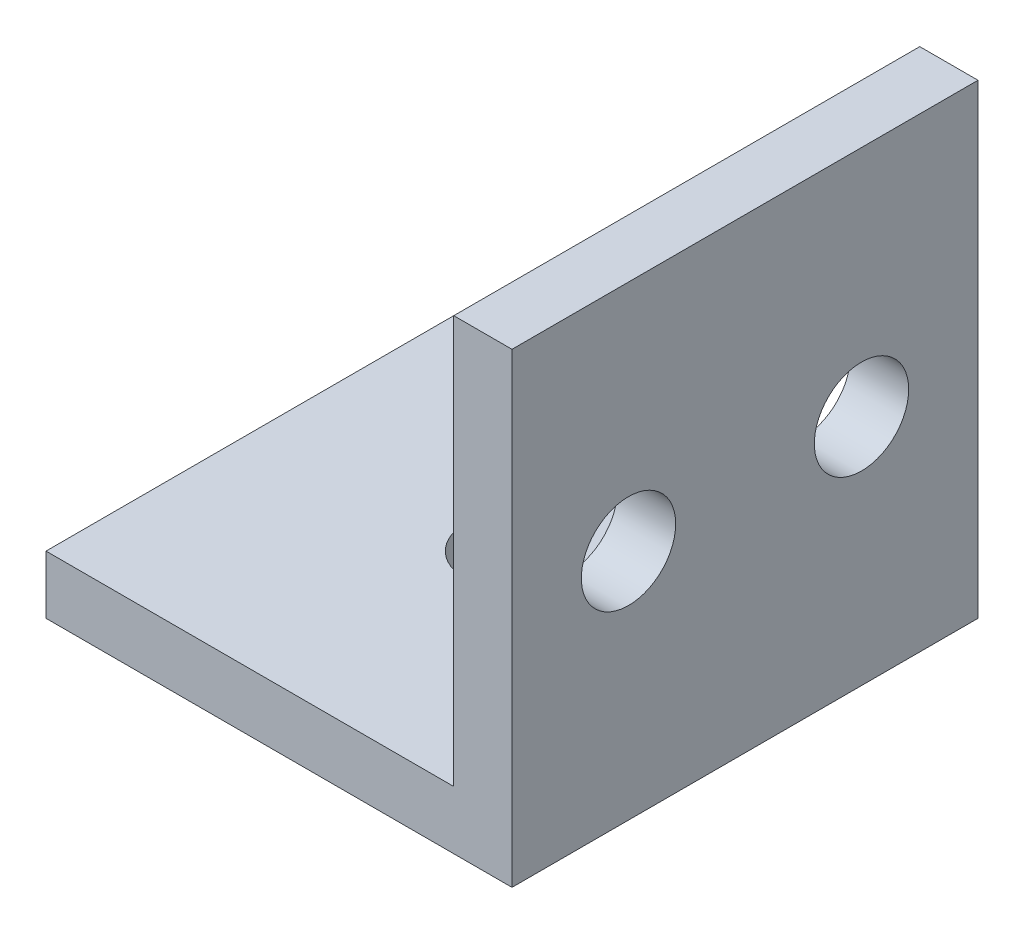
ISO-10303-21;
HEADER;
FILE_DESCRIPTION(('STEP AP214'),'2;1');
FILE_NAME('part.step','',(''),(''),'','','');
FILE_SCHEMA(('AUTOMOTIVE_DESIGN { 1 0 10303 214 1 1 1 1 }'));
ENDSEC;
DATA;
#1=APPLICATION_CONTEXT('core data for automotive mechanical design processes');
#2=APPLICATION_PROTOCOL_DEFINITION('international standard','automotive_design',2000,#1);
#3=PRODUCT_CONTEXT('',#1,'mechanical');
#4=PRODUCT('Part','Part','',(#3));
#5=PRODUCT_RELATED_PRODUCT_CATEGORY('part','',(#4));
#6=PRODUCT_DEFINITION_FORMATION('','',#4);
#7=PRODUCT_DEFINITION_CONTEXT('part definition',#1,'design');
#8=PRODUCT_DEFINITION('design','',#6,#7);
#9=PRODUCT_DEFINITION_SHAPE('','',#8);
#10=(LENGTH_UNIT() NAMED_UNIT(*) SI_UNIT(.MILLI.,.METRE.));
#11=(NAMED_UNIT(*) PLANE_ANGLE_UNIT() SI_UNIT($,.RADIAN.));
#12=(NAMED_UNIT(*) SI_UNIT($,.STERADIAN.) SOLID_ANGLE_UNIT());
#13=UNCERTAINTY_MEASURE_WITH_UNIT(LENGTH_MEASURE(1.E-05),#10,'distance_accuracy_value','');
#14=(GEOMETRIC_REPRESENTATION_CONTEXT(3) GLOBAL_UNCERTAINTY_ASSIGNED_CONTEXT((#13)) GLOBAL_UNIT_ASSIGNED_CONTEXT((#10,
#11,#12)) REPRESENTATION_CONTEXT('',''));
#15=CARTESIAN_POINT('',(0.,0.,0.));
#16=DIRECTION('',(0.,0.,1.));
#17=DIRECTION('',(1.,0.,0.));
#18=AXIS2_PLACEMENT_3D('',#15,#16,#17);
#19=CARTESIAN_POINT('',(0.,5.,0.));
#20=DIRECTION('',(0.,1.,0.));
#21=DIRECTION('',(0.,0.,1.));
#22=AXIS2_PLACEMENT_3D('',#19,#20,#21);
#23=PLANE('',#22);
#24=DIRECTION('',(0.,0.,1.));
#25=VECTOR('',#24,1.);
#26=CARTESIAN_POINT('',(15.,5.,-20.));
#27=LINE('',#26,#25);
#28=CARTESIAN_POINT('',(15.,5.,-20.));
#29=VERTEX_POINT('',#28);
#30=CARTESIAN_POINT('',(15.,5.,20.));
#31=VERTEX_POINT('',#30);
#32=EDGE_CURVE('E52',#29,#31,#27,.T.);
#33=ORIENTED_EDGE('',*,*,#32,.F.);
#34=DIRECTION('',(-1.,0.,0.));
#35=VECTOR('',#34,1.);
#36=CARTESIAN_POINT('',(-20.,5.,-20.));
#37=LINE('',#36,#35);
#38=CARTESIAN_POINT('',(-20.,5.,-20.));
#39=VERTEX_POINT('',#38);
#40=EDGE_CURVE('E57',#29,#39,#37,.T.);
#41=ORIENTED_EDGE('',*,*,#40,.T.);
#42=DIRECTION('',(0.,0.,1.));
#43=VECTOR('',#42,1.);
#44=CARTESIAN_POINT('',(-20.,5.,-20.));
#45=LINE('',#44,#43);
#46=CARTESIAN_POINT('',(-20.,5.,20.));
#47=VERTEX_POINT('',#46);
#48=EDGE_CURVE('E88',#39,#47,#45,.T.);
#49=ORIENTED_EDGE('',*,*,#48,.T.);
#50=DIRECTION('',(1.,0.,0.));
#51=VECTOR('',#50,1.);
#52=CARTESIAN_POINT('',(-20.,5.,20.));
#53=LINE('',#52,#51);
#54=EDGE_CURVE('E146',#47,#31,#53,.T.);
#55=ORIENTED_EDGE('',*,*,#54,.T.);
#56=EDGE_LOOP('',(#33,#41,#49,#55));
#57=FACE_BOUND('',#56,.T.);
#58=CARTESIAN_POINT('',(0.,5.,0.));
#59=DIRECTION('',(0.,1.,0.));
#60=DIRECTION('',(0.,0.,1.));
#61=AXIS2_PLACEMENT_3D('',#58,#59,#60);
#62=CIRCLE('',#61,4.05);
#63=CARTESIAN_POINT('',(0.,5.,4.05));
#64=VERTEX_POINT('',#63);
#65=EDGE_CURVE('E99',#64,#64,#62,.T.);
#66=ORIENTED_EDGE('',*,*,#65,.F.);
#67=EDGE_LOOP('',(#66));
#68=FACE_BOUND('',#67,.T.);
#69=ADVANCED_FACE('F35',(#57,#68),#23,.T.);
#70=CARTESIAN_POINT('',(0.,0.,0.));
#71=DIRECTION('',(0.,1.,0.));
#72=DIRECTION('',(0.,0.,1.));
#73=AXIS2_PLACEMENT_3D('',#70,#71,#72);
#74=PLANE('',#73);
#75=DIRECTION('',(0.,0.,1.));
#76=VECTOR('',#75,1.);
#77=CARTESIAN_POINT('',(-20.,0.,-20.));
#78=LINE('',#77,#76);
#79=CARTESIAN_POINT('',(-20.,0.,-20.));
#80=VERTEX_POINT('',#79);
#81=CARTESIAN_POINT('',(-20.,0.,20.));
#82=VERTEX_POINT('',#81);
#83=EDGE_CURVE('E94',#80,#82,#78,.T.);
#84=ORIENTED_EDGE('',*,*,#83,.F.);
#85=DIRECTION('',(-1.,0.,0.));
#86=VECTOR('',#85,1.);
#87=CARTESIAN_POINT('',(-20.,0.,-20.));
#88=LINE('',#87,#86);
#89=CARTESIAN_POINT('',(20.,0.,-20.));
#90=VERTEX_POINT('',#89);
#91=EDGE_CURVE('E77',#90,#80,#88,.T.);
#92=ORIENTED_EDGE('',*,*,#91,.F.);
#93=DIRECTION('',(0.,0.,-1.));
#94=VECTOR('',#93,1.);
#95=CARTESIAN_POINT('',(20.,0.,-20.));
#96=LINE('',#95,#94);
#97=CARTESIAN_POINT('',(20.,0.,20.));
#98=VERTEX_POINT('',#97);
#99=EDGE_CURVE('E89',#98,#90,#96,.T.);
#100=ORIENTED_EDGE('',*,*,#99,.F.);
#101=DIRECTION('',(1.,0.,0.));
#102=VECTOR('',#101,1.);
#103=CARTESIAN_POINT('',(-20.,0.,20.));
#104=LINE('',#103,#102);
#105=EDGE_CURVE('E98',#82,#98,#104,.T.);
#106=ORIENTED_EDGE('',*,*,#105,.F.);
#107=EDGE_LOOP('',(#84,#92,#100,#106));
#108=FACE_BOUND('',#107,.T.);
#109=CARTESIAN_POINT('',(0.,0.,0.));
#110=DIRECTION('',(0.,1.,0.));
#111=DIRECTION('',(0.,0.,1.));
#112=AXIS2_PLACEMENT_3D('',#109,#110,#111);
#113=CIRCLE('',#112,4.05);
#114=CARTESIAN_POINT('',(0.,0.,4.05));
#115=VERTEX_POINT('',#114);
#116=EDGE_CURVE('E103',#115,#115,#113,.T.);
#117=ORIENTED_EDGE('',*,*,#116,.T.);
#118=EDGE_LOOP('',(#117));
#119=FACE_BOUND('',#118,.T.);
#120=ADVANCED_FACE('F96',(#108,#119),#74,.F.);
#121=CARTESIAN_POINT('',(-20.,5.,-20.));
#122=DIRECTION('',(1.,0.,0.));
#123=DIRECTION('',(0.,0.,-1.));
#124=AXIS2_PLACEMENT_3D('',#121,#122,#123);
#125=PLANE('',#124);
#126=ORIENTED_EDGE('',*,*,#83,.T.);
#127=DIRECTION('',(0.,-1.,0.));
#128=VECTOR('',#127,1.);
#129=CARTESIAN_POINT('',(-20.,5.,20.));
#130=LINE('',#129,#128);
#131=EDGE_CURVE('E11',#47,#82,#130,.T.);
#132=ORIENTED_EDGE('',*,*,#131,.F.);
#133=ORIENTED_EDGE('',*,*,#48,.F.);
#134=DIRECTION('',(0.,-1.,0.));
#135=VECTOR('',#134,1.);
#136=CARTESIAN_POINT('',(-20.,5.,-20.));
#137=LINE('',#136,#135);
#138=EDGE_CURVE('E80',#39,#80,#137,.T.);
#139=ORIENTED_EDGE('',*,*,#138,.T.);
#140=EDGE_LOOP('',(#126,#132,#133,#139));
#141=FACE_BOUND('',#140,.T.);
#142=ADVANCED_FACE('F37',(#141),#125,.F.);
#143=CARTESIAN_POINT('',(-20.,5.,20.));
#144=DIRECTION('',(0.,0.,-1.));
#145=DIRECTION('',(-1.,0.,0.));
#146=AXIS2_PLACEMENT_3D('',#143,#144,#145);
#147=PLANE('',#146);
#148=ORIENTED_EDGE('',*,*,#105,.T.);
#149=DIRECTION('',(0.,-1.,0.));
#150=VECTOR('',#149,1.);
#151=CARTESIAN_POINT('',(20.,5.,20.));
#152=LINE('',#151,#150);
#153=CARTESIAN_POINT('',(20.,40.,20.));
#154=VERTEX_POINT('',#153);
#155=EDGE_CURVE('E44',#154,#98,#152,.T.);
#156=ORIENTED_EDGE('',*,*,#155,.F.);
#157=DIRECTION('',(1.,0.,0.));
#158=VECTOR('',#157,1.);
#159=CARTESIAN_POINT('',(15.,40.,20.));
#160=LINE('',#159,#158);
#161=CARTESIAN_POINT('',(15.,40.,20.));
#162=VERTEX_POINT('',#161);
#163=EDGE_CURVE('E128',#162,#154,#160,.T.);
#164=ORIENTED_EDGE('',*,*,#163,.F.);
#165=DIRECTION('',(0.,-1.,0.));
#166=VECTOR('',#165,1.);
#167=CARTESIAN_POINT('',(15.,40.,20.));
#168=LINE('',#167,#166);
#169=EDGE_CURVE('E141',#162,#31,#168,.T.);
#170=ORIENTED_EDGE('',*,*,#169,.T.);
#171=ORIENTED_EDGE('',*,*,#54,.F.);
#172=ORIENTED_EDGE('',*,*,#131,.T.);
#173=EDGE_LOOP('',(#148,#156,#164,#170,#171,#172));
#174=FACE_BOUND('',#173,.T.);
#175=ADVANCED_FACE('F153',(#174),#147,.F.);
#176=CARTESIAN_POINT('',(20.,5.,-20.));
#177=DIRECTION('',(-1.,0.,0.));
#178=DIRECTION('',(0.,0.,1.));
#179=AXIS2_PLACEMENT_3D('',#176,#177,#178);
#180=PLANE('',#179);
#181=CARTESIAN_POINT('',(20.,20.,10.));
#182=DIRECTION('',(1.,0.,0.));
#183=DIRECTION('',(0.,0.,-1.));
#184=AXIS2_PLACEMENT_3D('',#181,#182,#183);
#185=CIRCLE('',#184,4.05);
#186=CARTESIAN_POINT('',(20.,20.,5.95));
#187=VERTEX_POINT('',#186);
#188=EDGE_CURVE('E113',#187,#187,#185,.T.);
#189=ORIENTED_EDGE('',*,*,#188,.F.);
#190=EDGE_LOOP('',(#189));
#191=FACE_BOUND('',#190,.T.);
#192=CARTESIAN_POINT('',(20.,20.,-10.));
#193=DIRECTION('',(1.,0.,0.));
#194=DIRECTION('',(0.,0.,-1.));
#195=AXIS2_PLACEMENT_3D('',#192,#193,#194);
#196=CIRCLE('',#195,4.05);
#197=CARTESIAN_POINT('',(20.,20.,-14.05));
#198=VERTEX_POINT('',#197);
#199=EDGE_CURVE('E118',#198,#198,#196,.T.);
#200=ORIENTED_EDGE('',*,*,#199,.F.);
#201=EDGE_LOOP('',(#200));
#202=FACE_BOUND('',#201,.T.);
#203=ORIENTED_EDGE('',*,*,#99,.T.);
#204=DIRECTION('',(0.,-1.,0.));
#205=VECTOR('',#204,1.);
#206=CARTESIAN_POINT('',(20.,5.,-20.));
#207=LINE('',#206,#205);
#208=CARTESIAN_POINT('',(20.,40.,-20.));
#209=VERTEX_POINT('',#208);
#210=EDGE_CURVE('E84',#209,#90,#207,.T.);
#211=ORIENTED_EDGE('',*,*,#210,.F.);
#212=DIRECTION('',(0.,0.,-1.));
#213=VECTOR('',#212,1.);
#214=CARTESIAN_POINT('',(20.,40.,-20.));
#215=LINE('',#214,#213);
#216=EDGE_CURVE('E131',#154,#209,#215,.T.);
#217=ORIENTED_EDGE('',*,*,#216,.F.);
#218=ORIENTED_EDGE('',*,*,#155,.T.);
#219=EDGE_LOOP('',(#203,#211,#217,#218));
#220=FACE_BOUND('',#219,.T.);
#221=ADVANCED_FACE('F169',(#191,#202,#220),#180,.F.);
#222=CARTESIAN_POINT('',(-20.,5.,-20.));
#223=DIRECTION('',(0.,0.,1.));
#224=DIRECTION('',(1.,0.,0.));
#225=AXIS2_PLACEMENT_3D('',#222,#223,#224);
#226=PLANE('',#225);
#227=ORIENTED_EDGE('',*,*,#91,.T.);
#228=ORIENTED_EDGE('',*,*,#138,.F.);
#229=ORIENTED_EDGE('',*,*,#40,.F.);
#230=DIRECTION('',(0.,-1.,0.));
#231=VECTOR('',#230,1.);
#232=CARTESIAN_POINT('',(15.,40.,-20.));
#233=LINE('',#232,#231);
#234=CARTESIAN_POINT('',(15.,40.,-20.));
#235=VERTEX_POINT('',#234);
#236=EDGE_CURVE('E137',#235,#29,#233,.T.);
#237=ORIENTED_EDGE('',*,*,#236,.F.);
#238=DIRECTION('',(-1.,0.,0.));
#239=VECTOR('',#238,1.);
#240=CARTESIAN_POINT('',(15.,40.,-20.));
#241=LINE('',#240,#239);
#242=EDGE_CURVE('E134',#209,#235,#241,.T.);
#243=ORIENTED_EDGE('',*,*,#242,.F.);
#244=ORIENTED_EDGE('',*,*,#210,.T.);
#245=EDGE_LOOP('',(#227,#228,#229,#237,#243,#244));
#246=FACE_BOUND('',#245,.T.);
#247=ADVANCED_FACE('F79',(#246),#226,.F.);
#248=CARTESIAN_POINT('',(0.,5.,0.));
#249=DIRECTION('',(0.,-1.,0.));
#250=DIRECTION('',(0.,0.,-1.));
#251=AXIS2_PLACEMENT_3D('',#248,#249,#250);
#252=CYLINDRICAL_SURFACE('',#251,4.05);
#253=ORIENTED_EDGE('',*,*,#65,.T.);
#254=EDGE_LOOP('',(#253));
#255=FACE_BOUND('',#254,.T.);
#256=ORIENTED_EDGE('',*,*,#116,.F.);
#257=EDGE_LOOP('',(#256));
#258=FACE_BOUND('',#257,.T.);
#259=ADVANCED_FACE('F177',(#255,#258),#252,.F.);
#260=CARTESIAN_POINT('',(15.,40.,-20.));
#261=DIRECTION('',(1.,0.,0.));
#262=DIRECTION('',(0.,0.,-1.));
#263=AXIS2_PLACEMENT_3D('',#260,#261,#262);
#264=PLANE('',#263);
#265=CARTESIAN_POINT('',(15.,20.,10.));
#266=DIRECTION('',(1.,0.,0.));
#267=DIRECTION('',(0.,0.,-1.));
#268=AXIS2_PLACEMENT_3D('',#265,#266,#267);
#269=CIRCLE('',#268,4.05);
#270=CARTESIAN_POINT('',(15.,20.,5.95));
#271=VERTEX_POINT('',#270);
#272=EDGE_CURVE('E39',#271,#271,#269,.T.);
#273=ORIENTED_EDGE('',*,*,#272,.T.);
#274=EDGE_LOOP('',(#273));
#275=FACE_BOUND('',#274,.T.);
#276=CARTESIAN_POINT('',(15.,20.,-10.));
#277=DIRECTION('',(1.,0.,0.));
#278=DIRECTION('',(0.,0.,-1.));
#279=AXIS2_PLACEMENT_3D('',#276,#277,#278);
#280=CIRCLE('',#279,4.05);
#281=CARTESIAN_POINT('',(15.,20.,-14.05));
#282=VERTEX_POINT('',#281);
#283=EDGE_CURVE('E111',#282,#282,#280,.T.);
#284=ORIENTED_EDGE('',*,*,#283,.T.);
#285=EDGE_LOOP('',(#284));
#286=FACE_BOUND('',#285,.T.);
#287=ORIENTED_EDGE('',*,*,#32,.T.);
#288=ORIENTED_EDGE('',*,*,#169,.F.);
#289=DIRECTION('',(0.,0.,1.));
#290=VECTOR('',#289,1.);
#291=CARTESIAN_POINT('',(15.,40.,-20.));
#292=LINE('',#291,#290);
#293=EDGE_CURVE('E125',#235,#162,#292,.T.);
#294=ORIENTED_EDGE('',*,*,#293,.F.);
#295=ORIENTED_EDGE('',*,*,#236,.T.);
#296=EDGE_LOOP('',(#287,#288,#294,#295));
#297=FACE_BOUND('',#296,.T.);
#298=ADVANCED_FACE('F157',(#275,#286,#297),#264,.F.);
#299=CARTESIAN_POINT('',(0.,40.,0.));
#300=DIRECTION('',(0.,1.,0.));
#301=DIRECTION('',(0.,0.,1.));
#302=AXIS2_PLACEMENT_3D('',#299,#300,#301);
#303=PLANE('',#302);
#304=ORIENTED_EDGE('',*,*,#293,.T.);
#305=ORIENTED_EDGE('',*,*,#163,.T.);
#306=ORIENTED_EDGE('',*,*,#216,.T.);
#307=ORIENTED_EDGE('',*,*,#242,.T.);
#308=EDGE_LOOP('',(#304,#305,#306,#307));
#309=FACE_BOUND('',#308,.T.);
#310=ADVANCED_FACE('F168',(#309),#303,.T.);
#311=CARTESIAN_POINT('',(-15.,20.,-10.));
#312=DIRECTION('',(1.,0.,0.));
#313=DIRECTION('',(0.,0.,-1.));
#314=AXIS2_PLACEMENT_3D('',#311,#312,#313);
#315=CYLINDRICAL_SURFACE('',#314,4.05);
#316=ORIENTED_EDGE('',*,*,#199,.T.);
#317=EDGE_LOOP('',(#316));
#318=FACE_BOUND('',#317,.T.);
#319=ORIENTED_EDGE('',*,*,#283,.F.);
#320=EDGE_LOOP('',(#319));
#321=FACE_BOUND('',#320,.T.);
#322=ADVANCED_FACE('F195',(#318,#321),#315,.F.);
#323=CARTESIAN_POINT('',(-15.,20.,10.));
#324=DIRECTION('',(1.,0.,0.));
#325=DIRECTION('',(0.,0.,-1.));
#326=AXIS2_PLACEMENT_3D('',#323,#324,#325);
#327=CYLINDRICAL_SURFACE('',#326,4.05);
#328=ORIENTED_EDGE('',*,*,#188,.T.);
#329=EDGE_LOOP('',(#328));
#330=FACE_BOUND('',#329,.T.);
#331=ORIENTED_EDGE('',*,*,#272,.F.);
#332=EDGE_LOOP('',(#331));
#333=FACE_BOUND('',#332,.T.);
#334=ADVANCED_FACE('F198',(#330,#333),#327,.F.);
#335=CLOSED_SHELL('',(#69,#120,#142,#175,#221,#247,#259,#298,#310,#322,#334));
#336=MANIFOLD_SOLID_BREP('B2',#335);
#337=ADVANCED_BREP_SHAPE_REPRESENTATION('',(#18,#336),#14);
#338=SHAPE_DEFINITION_REPRESENTATION(#9,#337);
ENDSEC;
END-ISO-10303-21;
